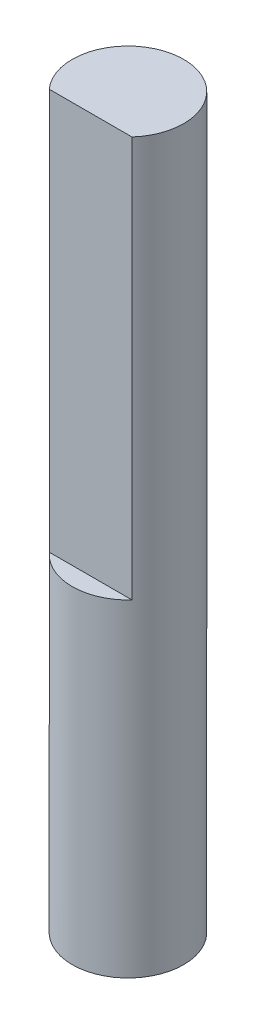
ISO-10303-21;
HEADER;
FILE_DESCRIPTION(('STEP AP214'),'2;1');
FILE_NAME('part.step','',(''),(''),'','','');
FILE_SCHEMA(('AUTOMOTIVE_DESIGN { 1 0 10303 214 1 1 1 1 }'));
ENDSEC;
DATA;
#1=APPLICATION_CONTEXT('core data for automotive mechanical design processes');
#2=APPLICATION_PROTOCOL_DEFINITION('international standard','automotive_design',2000,#1);
#3=PRODUCT_CONTEXT('',#1,'mechanical');
#4=PRODUCT('Part','Part','',(#3));
#5=PRODUCT_RELATED_PRODUCT_CATEGORY('part','',(#4));
#6=PRODUCT_DEFINITION_FORMATION('','',#4);
#7=PRODUCT_DEFINITION_CONTEXT('part definition',#1,'design');
#8=PRODUCT_DEFINITION('design','',#6,#7);
#9=PRODUCT_DEFINITION_SHAPE('','',#8);
#10=(LENGTH_UNIT() NAMED_UNIT(*) SI_UNIT(.MILLI.,.METRE.));
#11=(NAMED_UNIT(*) PLANE_ANGLE_UNIT() SI_UNIT($,.RADIAN.));
#12=(NAMED_UNIT(*) SI_UNIT($,.STERADIAN.) SOLID_ANGLE_UNIT());
#13=UNCERTAINTY_MEASURE_WITH_UNIT(LENGTH_MEASURE(1.E-05),#10,'distance_accuracy_value','');
#14=(GEOMETRIC_REPRESENTATION_CONTEXT(3) GLOBAL_UNCERTAINTY_ASSIGNED_CONTEXT((#13)) GLOBAL_UNIT_ASSIGNED_CONTEXT((#10,
#11,#12)) REPRESENTATION_CONTEXT('',''));
#15=CARTESIAN_POINT('',(0.,0.,0.));
#16=DIRECTION('',(0.,0.,1.));
#17=DIRECTION('',(1.,0.,0.));
#18=AXIS2_PLACEMENT_3D('',#15,#16,#17);
#19=CARTESIAN_POINT('',(0.,14.7,0.));
#20=DIRECTION('',(0.,-1.,0.));
#21=DIRECTION('',(0.,0.,-1.00000000000002));
#22=AXIS2_PLACEMENT_3D('',#19,#20,#21);
#23=CYLINDRICAL_SURFACE('',#22,2.5019);
#24=CARTESIAN_POINT('',(0.,14.7,0.));
#25=DIRECTION('',(0.,1.,0.));
#26=DIRECTION('',(0.,0.,1.00000000000002));
#27=AXIS2_PLACEMENT_3D('',#24,#25,#26);
#28=CIRCLE('',#27,2.5019);
#29=CARTESIAN_POINT('',(-1.85548836095692,14.7,1.67829274930017));
#30=VERTEX_POINT('',#29);
#31=CARTESIAN_POINT('',(1.85548836095693,14.7,1.67829274930017));
#32=VERTEX_POINT('',#31);
#33=EDGE_CURVE('E11',#30,#32,#28,.T.);
#34=ORIENTED_EDGE('',*,*,#33,.F.);
#35=DIRECTION('',(0.,-1.,0.));
#36=VECTOR('',#35,1.);
#37=CARTESIAN_POINT('',(-1.85548836095692,32.7,1.67829274930017));
#38=LINE('',#37,#36);
#39=CARTESIAN_POINT('',(-1.85548836095692,32.7,1.67829274930017));
#40=VERTEX_POINT('',#39);
#41=EDGE_CURVE('E79',#40,#30,#38,.T.);
#42=ORIENTED_EDGE('',*,*,#41,.F.);
#43=CARTESIAN_POINT('',(0.,32.7,0.));
#44=DIRECTION('',(0.,1.,0.));
#45=DIRECTION('',(0.,0.,1.00000000000002));
#46=AXIS2_PLACEMENT_3D('',#43,#44,#45);
#47=CIRCLE('',#46,2.5019);
#48=CARTESIAN_POINT('',(1.85548836095693,32.7,1.67829274930017));
#49=VERTEX_POINT('',#48);
#50=EDGE_CURVE('E81',#49,#40,#47,.T.);
#51=ORIENTED_EDGE('',*,*,#50,.F.);
#52=DIRECTION('',(0.,-1.,0.));
#53=VECTOR('',#52,1.);
#54=CARTESIAN_POINT('',(1.85548836095693,32.7,1.67829274930017));
#55=LINE('',#54,#53);
#56=EDGE_CURVE('E77',#49,#32,#55,.T.);
#57=ORIENTED_EDGE('',*,*,#56,.T.);
#58=EDGE_LOOP('',(#34,#42,#51,#57));
#59=FACE_BOUND('',#58,.T.);
#60=CARTESIAN_POINT('',(0.,0.,0.));
#61=DIRECTION('',(0.,1.,0.));
#62=DIRECTION('',(0.,0.,1.00000000000002));
#63=AXIS2_PLACEMENT_3D('',#60,#61,#62);
#64=CIRCLE('',#63,2.5019);
#65=CARTESIAN_POINT('',(0.,0.,2.50190000000004));
#66=VERTEX_POINT('',#65);
#67=EDGE_CURVE('E48',#66,#66,#64,.T.);
#68=ORIENTED_EDGE('',*,*,#67,.T.);
#69=EDGE_LOOP('',(#68));
#70=FACE_BOUND('',#69,.T.);
#71=ADVANCED_FACE('F45',(#59,#70),#23,.T.);
#72=CARTESIAN_POINT('',(0.,14.7,0.));
#73=DIRECTION('',(0.,1.,0.));
#74=DIRECTION('',(0.,0.,1.00000000000002));
#75=AXIS2_PLACEMENT_3D('',#72,#73,#74);
#76=PLANE('',#75);
#77=DIRECTION('',(1.00000000000001,0.,0.));
#78=VECTOR('',#77,1.);
#79=CARTESIAN_POINT('',(-1.85548836095692,14.7,1.67829274930017));
#80=LINE('',#79,#78);
#81=EDGE_CURVE('E58',#30,#32,#80,.T.);
#82=ORIENTED_EDGE('',*,*,#81,.F.);
#83=ORIENTED_EDGE('',*,*,#33,.T.);
#84=EDGE_LOOP('',(#82,#83));
#85=FACE_BOUND('',#84,.T.);
#86=ADVANCED_FACE('F70',(#85),#76,.T.);
#87=CARTESIAN_POINT('',(0.,0.,0.));
#88=DIRECTION('',(0.,1.,0.));
#89=DIRECTION('',(0.,0.,1.00000000000002));
#90=AXIS2_PLACEMENT_3D('',#87,#88,#89);
#91=PLANE('',#90);
#92=ORIENTED_EDGE('',*,*,#67,.F.);
#93=EDGE_LOOP('',(#92));
#94=FACE_BOUND('',#93,.T.);
#95=ADVANCED_FACE('F101',(#94),#91,.F.);
#96=CARTESIAN_POINT('',(-1.85548836095692,32.7,1.67829274930017));
#97=DIRECTION('',(0.,0.,-1.00000000000002));
#98=DIRECTION('',(-1.00000000000002,0.,0.));
#99=AXIS2_PLACEMENT_3D('',#96,#97,#98);
#100=PLANE('',#99);
#101=ORIENTED_EDGE('',*,*,#81,.T.);
#102=ORIENTED_EDGE('',*,*,#56,.F.);
#103=DIRECTION('',(1.00000000000001,0.,0.));
#104=VECTOR('',#103,1.);
#105=CARTESIAN_POINT('',(-1.85548836095692,32.7,1.67829274930017));
#106=LINE('',#105,#104);
#107=EDGE_CURVE('E66',#40,#49,#106,.T.);
#108=ORIENTED_EDGE('',*,*,#107,.F.);
#109=ORIENTED_EDGE('',*,*,#41,.T.);
#110=EDGE_LOOP('',(#101,#102,#108,#109));
#111=FACE_BOUND('',#110,.T.);
#112=ADVANCED_FACE('F76',(#111),#100,.F.);
#113=CARTESIAN_POINT('',(0.,32.7,0.));
#114=DIRECTION('',(0.,1.,0.));
#115=DIRECTION('',(0.,0.,1.00000000000002));
#116=AXIS2_PLACEMENT_3D('',#113,#114,#115);
#117=PLANE('',#116);
#118=ORIENTED_EDGE('',*,*,#50,.T.);
#119=ORIENTED_EDGE('',*,*,#107,.T.);
#120=EDGE_LOOP('',(#118,#119));
#121=FACE_BOUND('',#120,.T.);
#122=ADVANCED_FACE('F94',(#121),#117,.T.);
#123=CLOSED_SHELL('',(#71,#86,#95,#112,#122));
#124=MANIFOLD_SOLID_BREP('B2',#123);
#125=ADVANCED_BREP_SHAPE_REPRESENTATION('',(#18,#124),#14);
#126=SHAPE_DEFINITION_REPRESENTATION(#9,#125);
ENDSEC;
END-ISO-10303-21;
